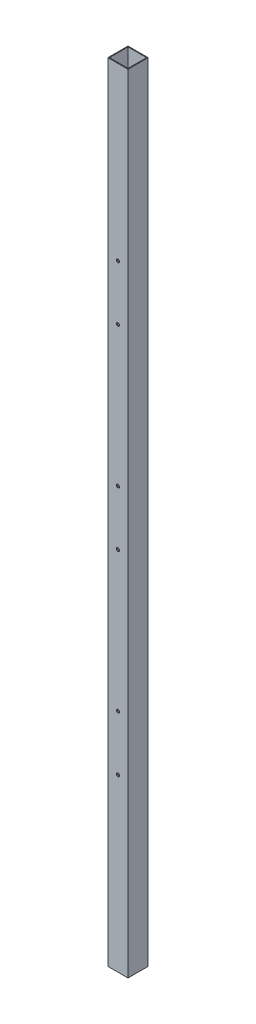
ISO-10303-21;
HEADER;
FILE_DESCRIPTION(('STEP AP214'),'2;1');
FILE_NAME('part.step','',(''),(''),'','','');
FILE_SCHEMA(('AUTOMOTIVE_DESIGN { 1 0 10303 214 1 1 1 1 }'));
ENDSEC;
DATA;
#1=APPLICATION_CONTEXT('core data for automotive mechanical design processes');
#2=APPLICATION_PROTOCOL_DEFINITION('international standard','automotive_design',2000,#1);
#3=PRODUCT_CONTEXT('',#1,'mechanical');
#4=PRODUCT('Part','Part','',(#3));
#5=PRODUCT_RELATED_PRODUCT_CATEGORY('part','',(#4));
#6=PRODUCT_DEFINITION_FORMATION('','',#4);
#7=PRODUCT_DEFINITION_CONTEXT('part definition',#1,'design');
#8=PRODUCT_DEFINITION('design','',#6,#7);
#9=PRODUCT_DEFINITION_SHAPE('','',#8);
#10=(LENGTH_UNIT() NAMED_UNIT(*) SI_UNIT(.MILLI.,.METRE.));
#11=(NAMED_UNIT(*) PLANE_ANGLE_UNIT() SI_UNIT($,.RADIAN.));
#12=(NAMED_UNIT(*) SI_UNIT($,.STERADIAN.) SOLID_ANGLE_UNIT());
#13=UNCERTAINTY_MEASURE_WITH_UNIT(LENGTH_MEASURE(1.E-05),#10,'distance_accuracy_value','');
#14=(GEOMETRIC_REPRESENTATION_CONTEXT(3) GLOBAL_UNCERTAINTY_ASSIGNED_CONTEXT((#13)) GLOBAL_UNIT_ASSIGNED_CONTEXT((#10,
#11,#12)) REPRESENTATION_CONTEXT('',''));
#15=CARTESIAN_POINT('',(0.,0.,0.));
#16=DIRECTION('',(0.,0.,1.));
#17=DIRECTION('',(1.,0.,0.));
#18=AXIS2_PLACEMENT_3D('',#15,#16,#17);
#19=CARTESIAN_POINT('',(0.,1000.,0.));
#20=DIRECTION('',(0.,1.,0.));
#21=DIRECTION('',(0.,0.,1.));
#22=AXIS2_PLACEMENT_3D('',#19,#20,#21);
#23=PLANE('',#22);
#24=DIRECTION('',(0.,0.,-1.));
#25=VECTOR('',#24,1.);
#26=CARTESIAN_POINT('',(12.8,1000.,-12.8));
#27=LINE('',#26,#25);
#28=CARTESIAN_POINT('',(12.8,1000.,12.8));
#29=VERTEX_POINT('',#28);
#30=CARTESIAN_POINT('',(12.8,1000.,-12.8));
#31=VERTEX_POINT('',#30);
#32=EDGE_CURVE('E151',#29,#31,#27,.T.);
#33=ORIENTED_EDGE('',*,*,#32,.T.);
#34=DIRECTION('',(-1.,0.,0.));
#35=VECTOR('',#34,1.);
#36=CARTESIAN_POINT('',(-12.8,1000.,-12.8));
#37=LINE('',#36,#35);
#38=CARTESIAN_POINT('',(-12.8,1000.,-12.8));
#39=VERTEX_POINT('',#38);
#40=EDGE_CURVE('E154',#31,#39,#37,.T.);
#41=ORIENTED_EDGE('',*,*,#40,.T.);
#42=DIRECTION('',(0.,0.,1.));
#43=VECTOR('',#42,1.);
#44=CARTESIAN_POINT('',(-12.8,1000.,-12.8));
#45=LINE('',#44,#43);
#46=CARTESIAN_POINT('',(-12.8,1000.,12.8));
#47=VERTEX_POINT('',#46);
#48=EDGE_CURVE('E157',#39,#47,#45,.T.);
#49=ORIENTED_EDGE('',*,*,#48,.T.);
#50=DIRECTION('',(1.,0.,0.));
#51=VECTOR('',#50,1.);
#52=CARTESIAN_POINT('',(-12.8,1000.,12.8));
#53=LINE('',#52,#51);
#54=EDGE_CURVE('E159',#47,#29,#53,.T.);
#55=ORIENTED_EDGE('',*,*,#54,.T.);
#56=EDGE_LOOP('',(#33,#41,#49,#55));
#57=FACE_BOUND('',#56,.T.);
#58=DIRECTION('',(1.,0.,0.));
#59=VECTOR('',#58,1.);
#60=CARTESIAN_POINT('',(-11.8,1000.,11.8));
#61=LINE('',#60,#59);
#62=CARTESIAN_POINT('',(-11.8,1000.,11.8));
#63=VERTEX_POINT('',#62);
#64=CARTESIAN_POINT('',(11.8,1000.,11.8));
#65=VERTEX_POINT('',#64);
#66=EDGE_CURVE('E121',#63,#65,#61,.T.);
#67=ORIENTED_EDGE('',*,*,#66,.F.);
#68=DIRECTION('',(0.,0.,1.));
#69=VECTOR('',#68,1.);
#70=CARTESIAN_POINT('',(-11.8,1000.,-11.8));
#71=LINE('',#70,#69);
#72=CARTESIAN_POINT('',(-11.8,1000.,-11.8));
#73=VERTEX_POINT('',#72);
#74=EDGE_CURVE('E113',#73,#63,#71,.T.);
#75=ORIENTED_EDGE('',*,*,#74,.F.);
#76=DIRECTION('',(-1.,0.,0.));
#77=VECTOR('',#76,1.);
#78=CARTESIAN_POINT('',(-11.8,1000.,-11.8));
#79=LINE('',#78,#77);
#80=CARTESIAN_POINT('',(11.8,1000.,-11.8));
#81=VERTEX_POINT('',#80);
#82=EDGE_CURVE('E135',#81,#73,#79,.T.);
#83=ORIENTED_EDGE('',*,*,#82,.F.);
#84=DIRECTION('',(0.,0.,-1.));
#85=VECTOR('',#84,1.);
#86=CARTESIAN_POINT('',(11.8,1000.,-11.8));
#87=LINE('',#86,#85);
#88=EDGE_CURVE('E133',#65,#81,#87,.T.);
#89=ORIENTED_EDGE('',*,*,#88,.F.);
#90=EDGE_LOOP('',(#67,#75,#83,#89));
#91=FACE_BOUND('',#90,.T.);
#92=ADVANCED_FACE('F46',(#57,#91),#23,.T.);
#93=CARTESIAN_POINT('',(0.,0.,0.));
#94=DIRECTION('',(0.,1.,0.));
#95=DIRECTION('',(0.,0.,1.));
#96=AXIS2_PLACEMENT_3D('',#93,#94,#95);
#97=PLANE('',#96);
#98=DIRECTION('',(0.,0.,-1.));
#99=VECTOR('',#98,1.);
#100=CARTESIAN_POINT('',(12.8,0.,-12.8));
#101=LINE('',#100,#99);
#102=CARTESIAN_POINT('',(12.8,0.,12.8));
#103=VERTEX_POINT('',#102);
#104=CARTESIAN_POINT('',(12.8,0.,-12.8));
#105=VERTEX_POINT('',#104);
#106=EDGE_CURVE('E129',#103,#105,#101,.T.);
#107=ORIENTED_EDGE('',*,*,#106,.F.);
#108=DIRECTION('',(1.,0.,0.));
#109=VECTOR('',#108,1.);
#110=CARTESIAN_POINT('',(-12.8,0.,12.8));
#111=LINE('',#110,#109);
#112=CARTESIAN_POINT('',(-12.8,0.,12.8));
#113=VERTEX_POINT('',#112);
#114=EDGE_CURVE('E155',#113,#103,#111,.T.);
#115=ORIENTED_EDGE('',*,*,#114,.F.);
#116=DIRECTION('',(0.,0.,1.));
#117=VECTOR('',#116,1.);
#118=CARTESIAN_POINT('',(-12.8,0.,-12.8));
#119=LINE('',#118,#117);
#120=CARTESIAN_POINT('',(-12.8,0.,-12.8));
#121=VERTEX_POINT('',#120);
#122=EDGE_CURVE('E166',#121,#113,#119,.T.);
#123=ORIENTED_EDGE('',*,*,#122,.F.);
#124=DIRECTION('',(-1.,0.,0.));
#125=VECTOR('',#124,1.);
#126=CARTESIAN_POINT('',(-12.8,0.,-12.8));
#127=LINE('',#126,#125);
#128=EDGE_CURVE('E164',#105,#121,#127,.T.);
#129=ORIENTED_EDGE('',*,*,#128,.F.);
#130=EDGE_LOOP('',(#107,#115,#123,#129));
#131=FACE_BOUND('',#130,.T.);
#132=DIRECTION('',(0.,0.,1.));
#133=VECTOR('',#132,1.);
#134=CARTESIAN_POINT('',(-11.8,0.,-11.8));
#135=LINE('',#134,#133);
#136=CARTESIAN_POINT('',(-11.8,0.,-11.8));
#137=VERTEX_POINT('',#136);
#138=CARTESIAN_POINT('',(-11.8,0.,11.8));
#139=VERTEX_POINT('',#138);
#140=EDGE_CURVE('E71',#137,#139,#135,.T.);
#141=ORIENTED_EDGE('',*,*,#140,.T.);
#142=DIRECTION('',(1.,0.,0.));
#143=VECTOR('',#142,1.);
#144=CARTESIAN_POINT('',(-11.8,0.,11.8));
#145=LINE('',#144,#143);
#146=CARTESIAN_POINT('',(11.8,0.,11.8));
#147=VERTEX_POINT('',#146);
#148=EDGE_CURVE('E128',#139,#147,#145,.T.);
#149=ORIENTED_EDGE('',*,*,#148,.T.);
#150=DIRECTION('',(0.,0.,-1.));
#151=VECTOR('',#150,1.);
#152=CARTESIAN_POINT('',(11.8,0.,-11.8));
#153=LINE('',#152,#151);
#154=CARTESIAN_POINT('',(11.8,0.,-11.8));
#155=VERTEX_POINT('',#154);
#156=EDGE_CURVE('E143',#147,#155,#153,.T.);
#157=ORIENTED_EDGE('',*,*,#156,.T.);
#158=DIRECTION('',(-1.,0.,0.));
#159=VECTOR('',#158,1.);
#160=CARTESIAN_POINT('',(-11.8,0.,-11.8));
#161=LINE('',#160,#159);
#162=EDGE_CURVE('E122',#155,#137,#161,.T.);
#163=ORIENTED_EDGE('',*,*,#162,.T.);
#164=EDGE_LOOP('',(#141,#149,#157,#163));
#165=FACE_BOUND('',#164,.T.);
#166=ADVANCED_FACE('F241',(#131,#165),#97,.F.);
#167=CARTESIAN_POINT('',(12.8,1000.,-12.8));
#168=DIRECTION('',(-1.,0.,0.));
#169=DIRECTION('',(0.,0.,1.));
#170=AXIS2_PLACEMENT_3D('',#167,#168,#169);
#171=PLANE('',#170);
#172=ORIENTED_EDGE('',*,*,#106,.T.);
#173=DIRECTION('',(0.,-1.,0.));
#174=VECTOR('',#173,1.);
#175=CARTESIAN_POINT('',(12.8,1000.,-12.8));
#176=LINE('',#175,#174);
#177=EDGE_CURVE('E11',#31,#105,#176,.T.);
#178=ORIENTED_EDGE('',*,*,#177,.F.);
#179=ORIENTED_EDGE('',*,*,#32,.F.);
#180=DIRECTION('',(0.,-1.,0.));
#181=VECTOR('',#180,1.);
#182=CARTESIAN_POINT('',(12.8,1000.,12.8));
#183=LINE('',#182,#181);
#184=EDGE_CURVE('E161',#29,#103,#183,.T.);
#185=ORIENTED_EDGE('',*,*,#184,.T.);
#186=EDGE_LOOP('',(#172,#178,#179,#185));
#187=FACE_BOUND('',#186,.T.);
#188=ADVANCED_FACE('F48',(#187),#171,.F.);
#189=CARTESIAN_POINT('',(-12.8,1000.,-12.8));
#190=DIRECTION('',(0.,0.,1.));
#191=DIRECTION('',(1.,0.,0.));
#192=AXIS2_PLACEMENT_3D('',#189,#190,#191);
#193=PLANE('',#192);
#194=CARTESIAN_POINT('',(0.,217.2,-12.8));
#195=DIRECTION('',(0.,0.,-1.));
#196=DIRECTION('',(1.,0.,0.));
#197=AXIS2_PLACEMENT_3D('',#194,#195,#196);
#198=CIRCLE('',#197,2.);
#199=CARTESIAN_POINT('',(2.00000000000001,217.2,-12.8));
#200=VERTEX_POINT('',#199);
#201=EDGE_CURVE('E268',#200,#200,#198,.T.);
#202=ORIENTED_EDGE('',*,*,#201,.F.);
#203=EDGE_LOOP('',(#202));
#204=FACE_BOUND('',#203,.T.);
#205=CARTESIAN_POINT('',(0.,465.,-12.8));
#206=DIRECTION('',(0.,0.,-1.));
#207=DIRECTION('',(-1.,0.,0.));
#208=AXIS2_PLACEMENT_3D('',#205,#206,#207);
#209=CIRCLE('',#208,2.);
#210=CARTESIAN_POINT('',(-2.,465.,-12.8));
#211=VERTEX_POINT('',#210);
#212=EDGE_CURVE('E272',#211,#211,#209,.T.);
#213=ORIENTED_EDGE('',*,*,#212,.F.);
#214=EDGE_LOOP('',(#213));
#215=FACE_BOUND('',#214,.T.);
#216=CARTESIAN_POINT('',(0.,782.8,-12.8));
#217=DIRECTION('',(0.,0.,-1.));
#218=DIRECTION('',(-1.,0.,0.));
#219=AXIS2_PLACEMENT_3D('',#216,#217,#218);
#220=CIRCLE('',#219,2.);
#221=CARTESIAN_POINT('',(-1.99999999999999,782.8,-12.8));
#222=VERTEX_POINT('',#221);
#223=EDGE_CURVE('E276',#222,#222,#220,.T.);
#224=ORIENTED_EDGE('',*,*,#223,.F.);
#225=EDGE_LOOP('',(#224));
#226=FACE_BOUND('',#225,.T.);
#227=CARTESIAN_POINT('',(0.,712.8,-12.8));
#228=DIRECTION('',(0.,0.,-1.));
#229=DIRECTION('',(-1.,0.,0.));
#230=AXIS2_PLACEMENT_3D('',#227,#228,#229);
#231=CIRCLE('',#230,2.);
#232=CARTESIAN_POINT('',(-2.,712.8,-12.8));
#233=VERTEX_POINT('',#232);
#234=EDGE_CURVE('E280',#233,#233,#231,.T.);
#235=ORIENTED_EDGE('',*,*,#234,.F.);
#236=EDGE_LOOP('',(#235));
#237=FACE_BOUND('',#236,.T.);
#238=CARTESIAN_POINT('',(0.,287.2,-12.8));
#239=DIRECTION('',(0.,0.,-1.));
#240=DIRECTION('',(1.,0.,0.));
#241=AXIS2_PLACEMENT_3D('',#238,#239,#240);
#242=CIRCLE('',#241,2.);
#243=CARTESIAN_POINT('',(2.,287.2,-12.8));
#244=VERTEX_POINT('',#243);
#245=EDGE_CURVE('E284',#244,#244,#242,.T.);
#246=ORIENTED_EDGE('',*,*,#245,.F.);
#247=EDGE_LOOP('',(#246));
#248=FACE_BOUND('',#247,.T.);
#249=CARTESIAN_POINT('',(0.,535.,-12.8));
#250=DIRECTION('',(0.,0.,-1.));
#251=DIRECTION('',(-1.,0.,0.));
#252=AXIS2_PLACEMENT_3D('',#249,#250,#251);
#253=CIRCLE('',#252,2.);
#254=CARTESIAN_POINT('',(-2.,535.,-12.8));
#255=VERTEX_POINT('',#254);
#256=EDGE_CURVE('E180',#255,#255,#253,.T.);
#257=ORIENTED_EDGE('',*,*,#256,.F.);
#258=EDGE_LOOP('',(#257));
#259=FACE_BOUND('',#258,.T.);
#260=ORIENTED_EDGE('',*,*,#128,.T.);
#261=DIRECTION('',(0.,-1.,0.));
#262=VECTOR('',#261,1.);
#263=CARTESIAN_POINT('',(-12.8,1000.,-12.8));
#264=LINE('',#263,#262);
#265=EDGE_CURVE('E55',#39,#121,#264,.T.);
#266=ORIENTED_EDGE('',*,*,#265,.F.);
#267=ORIENTED_EDGE('',*,*,#40,.F.);
#268=ORIENTED_EDGE('',*,*,#177,.T.);
#269=EDGE_LOOP('',(#260,#266,#267,#268));
#270=FACE_BOUND('',#269,.T.);
#271=ADVANCED_FACE('F256',(#204,#215,#226,#237,#248,#259,#270),#193,.F.);
#272=CARTESIAN_POINT('',(-12.8,1000.,-12.8));
#273=DIRECTION('',(1.,0.,0.));
#274=DIRECTION('',(0.,0.,-1.));
#275=AXIS2_PLACEMENT_3D('',#272,#273,#274);
#276=PLANE('',#275);
#277=ORIENTED_EDGE('',*,*,#122,.T.);
#278=DIRECTION('',(0.,-1.,0.));
#279=VECTOR('',#278,1.);
#280=CARTESIAN_POINT('',(-12.8,1000.,12.8));
#281=LINE('',#280,#279);
#282=EDGE_CURVE('E171',#47,#113,#281,.T.);
#283=ORIENTED_EDGE('',*,*,#282,.F.);
#284=ORIENTED_EDGE('',*,*,#48,.F.);
#285=ORIENTED_EDGE('',*,*,#265,.T.);
#286=EDGE_LOOP('',(#277,#283,#284,#285));
#287=FACE_BOUND('',#286,.T.);
#288=ADVANCED_FACE('F254',(#287),#276,.F.);
#289=CARTESIAN_POINT('',(-12.8,1000.,12.8));
#290=DIRECTION('',(0.,0.,-1.));
#291=DIRECTION('',(-1.,0.,0.));
#292=AXIS2_PLACEMENT_3D('',#289,#290,#291);
#293=PLANE('',#292);
#294=CARTESIAN_POINT('',(0.,217.2,12.8));
#295=DIRECTION('',(0.,0.,-1.));
#296=DIRECTION('',(-1.,0.,0.));
#297=AXIS2_PLACEMENT_3D('',#294,#295,#296);
#298=CIRCLE('',#297,2.);
#299=CARTESIAN_POINT('',(-1.99999999999999,217.2,12.8));
#300=VERTEX_POINT('',#299);
#301=EDGE_CURVE('E141',#300,#300,#298,.T.);
#302=ORIENTED_EDGE('',*,*,#301,.T.);
#303=EDGE_LOOP('',(#302));
#304=FACE_BOUND('',#303,.T.);
#305=CARTESIAN_POINT('',(0.,465.,12.8));
#306=DIRECTION('',(0.,0.,-1.));
#307=DIRECTION('',(-1.,0.,0.));
#308=AXIS2_PLACEMENT_3D('',#305,#306,#307);
#309=CIRCLE('',#308,2.);
#310=CARTESIAN_POINT('',(-2.,465.,12.8));
#311=VERTEX_POINT('',#310);
#312=EDGE_CURVE('E202',#311,#311,#309,.T.);
#313=ORIENTED_EDGE('',*,*,#312,.T.);
#314=EDGE_LOOP('',(#313));
#315=FACE_BOUND('',#314,.T.);
#316=CARTESIAN_POINT('',(0.,782.8,12.8));
#317=DIRECTION('',(0.,0.,-1.));
#318=DIRECTION('',(-1.,0.,0.));
#319=AXIS2_PLACEMENT_3D('',#316,#317,#318);
#320=CIRCLE('',#319,2.);
#321=CARTESIAN_POINT('',(-1.99999999999999,782.8,12.8));
#322=VERTEX_POINT('',#321);
#323=EDGE_CURVE('E198',#322,#322,#320,.T.);
#324=ORIENTED_EDGE('',*,*,#323,.T.);
#325=EDGE_LOOP('',(#324));
#326=FACE_BOUND('',#325,.T.);
#327=CARTESIAN_POINT('',(0.,712.8,12.8));
#328=DIRECTION('',(0.,0.,-1.));
#329=DIRECTION('',(-1.,0.,0.));
#330=AXIS2_PLACEMENT_3D('',#327,#328,#329);
#331=CIRCLE('',#330,2.);
#332=CARTESIAN_POINT('',(-2.,712.8,12.8));
#333=VERTEX_POINT('',#332);
#334=EDGE_CURVE('E194',#333,#333,#331,.T.);
#335=ORIENTED_EDGE('',*,*,#334,.T.);
#336=EDGE_LOOP('',(#335));
#337=FACE_BOUND('',#336,.T.);
#338=CARTESIAN_POINT('',(0.,287.2,12.8));
#339=DIRECTION('',(0.,0.,-1.));
#340=DIRECTION('',(-1.,0.,0.));
#341=AXIS2_PLACEMENT_3D('',#338,#339,#340);
#342=CIRCLE('',#341,2.);
#343=CARTESIAN_POINT('',(-2.,287.2,12.8));
#344=VERTEX_POINT('',#343);
#345=EDGE_CURVE('E190',#344,#344,#342,.T.);
#346=ORIENTED_EDGE('',*,*,#345,.T.);
#347=EDGE_LOOP('',(#346));
#348=FACE_BOUND('',#347,.T.);
#349=CARTESIAN_POINT('',(0.,535.,12.8));
#350=DIRECTION('',(0.,0.,-1.));
#351=DIRECTION('',(-1.,0.,0.));
#352=AXIS2_PLACEMENT_3D('',#349,#350,#351);
#353=CIRCLE('',#352,2.);
#354=CARTESIAN_POINT('',(-2.,535.,12.8));
#355=VERTEX_POINT('',#354);
#356=EDGE_CURVE('E185',#355,#355,#353,.T.);
#357=ORIENTED_EDGE('',*,*,#356,.T.);
#358=EDGE_LOOP('',(#357));
#359=FACE_BOUND('',#358,.T.);
#360=ORIENTED_EDGE('',*,*,#114,.T.);
#361=ORIENTED_EDGE('',*,*,#184,.F.);
#362=ORIENTED_EDGE('',*,*,#54,.F.);
#363=ORIENTED_EDGE('',*,*,#282,.T.);
#364=EDGE_LOOP('',(#360,#361,#362,#363));
#365=FACE_BOUND('',#364,.T.);
#366=ADVANCED_FACE('F219',(#304,#315,#326,#337,#348,#359,#365),#293,.F.);
#367=CARTESIAN_POINT('',(-11.8,1000.,-11.8));
#368=DIRECTION('',(1.,0.,0.));
#369=DIRECTION('',(0.,0.,-1.));
#370=AXIS2_PLACEMENT_3D('',#367,#368,#369);
#371=PLANE('',#370);
#372=ORIENTED_EDGE('',*,*,#140,.F.);
#373=DIRECTION('',(0.,-1.,0.));
#374=VECTOR('',#373,1.);
#375=CARTESIAN_POINT('',(-11.8,1000.,-11.8));
#376=LINE('',#375,#374);
#377=EDGE_CURVE('E117',#73,#137,#376,.T.);
#378=ORIENTED_EDGE('',*,*,#377,.F.);
#379=ORIENTED_EDGE('',*,*,#74,.T.);
#380=DIRECTION('',(0.,-1.,0.));
#381=VECTOR('',#380,1.);
#382=CARTESIAN_POINT('',(-11.8,1000.,11.8));
#383=LINE('',#382,#381);
#384=EDGE_CURVE('E116',#63,#139,#383,.T.);
#385=ORIENTED_EDGE('',*,*,#384,.T.);
#386=EDGE_LOOP('',(#372,#378,#379,#385));
#387=FACE_BOUND('',#386,.T.);
#388=ADVANCED_FACE('F115',(#387),#371,.T.);
#389=CARTESIAN_POINT('',(-11.8,1000.,11.8));
#390=DIRECTION('',(0.,0.,-1.));
#391=DIRECTION('',(-1.,0.,0.));
#392=AXIS2_PLACEMENT_3D('',#389,#390,#391);
#393=PLANE('',#392);
#394=CARTESIAN_POINT('',(0.,217.2,11.8));
#395=DIRECTION('',(0.,0.,-1.));
#396=DIRECTION('',(-1.,0.,0.));
#397=AXIS2_PLACEMENT_3D('',#394,#395,#396);
#398=CIRCLE('',#397,2.);
#399=CARTESIAN_POINT('',(-1.99999999999999,217.2,11.8));
#400=VERTEX_POINT('',#399);
#401=EDGE_CURVE('E214',#400,#400,#398,.T.);
#402=ORIENTED_EDGE('',*,*,#401,.F.);
#403=EDGE_LOOP('',(#402));
#404=FACE_BOUND('',#403,.T.);
#405=CARTESIAN_POINT('',(0.,465.,11.8));
#406=DIRECTION('',(0.,0.,-1.));
#407=DIRECTION('',(-1.,0.,0.));
#408=AXIS2_PLACEMENT_3D('',#405,#406,#407);
#409=CIRCLE('',#408,2.);
#410=CARTESIAN_POINT('',(-2.,465.,11.8));
#411=VERTEX_POINT('',#410);
#412=EDGE_CURVE('E197',#411,#411,#409,.T.);
#413=ORIENTED_EDGE('',*,*,#412,.F.);
#414=EDGE_LOOP('',(#413));
#415=FACE_BOUND('',#414,.T.);
#416=CARTESIAN_POINT('',(0.,782.8,11.8));
#417=DIRECTION('',(0.,0.,-1.));
#418=DIRECTION('',(-1.,0.,0.));
#419=AXIS2_PLACEMENT_3D('',#416,#417,#418);
#420=CIRCLE('',#419,2.);
#421=CARTESIAN_POINT('',(-1.99999999999999,782.8,11.8));
#422=VERTEX_POINT('',#421);
#423=EDGE_CURVE('E193',#422,#422,#420,.T.);
#424=ORIENTED_EDGE('',*,*,#423,.F.);
#425=EDGE_LOOP('',(#424));
#426=FACE_BOUND('',#425,.T.);
#427=CARTESIAN_POINT('',(0.,712.8,11.8));
#428=DIRECTION('',(0.,0.,-1.));
#429=DIRECTION('',(-1.,0.,0.));
#430=AXIS2_PLACEMENT_3D('',#427,#428,#429);
#431=CIRCLE('',#430,2.);
#432=CARTESIAN_POINT('',(-2.,712.8,11.8));
#433=VERTEX_POINT('',#432);
#434=EDGE_CURVE('E189',#433,#433,#431,.T.);
#435=ORIENTED_EDGE('',*,*,#434,.F.);
#436=EDGE_LOOP('',(#435));
#437=FACE_BOUND('',#436,.T.);
#438=CARTESIAN_POINT('',(0.,287.2,11.8));
#439=DIRECTION('',(0.,0.,-1.));
#440=DIRECTION('',(-1.,0.,0.));
#441=AXIS2_PLACEMENT_3D('',#438,#439,#440);
#442=CIRCLE('',#441,2.);
#443=CARTESIAN_POINT('',(-2.,287.2,11.8));
#444=VERTEX_POINT('',#443);
#445=EDGE_CURVE('E184',#444,#444,#442,.T.);
#446=ORIENTED_EDGE('',*,*,#445,.F.);
#447=EDGE_LOOP('',(#446));
#448=FACE_BOUND('',#447,.T.);
#449=CARTESIAN_POINT('',(0.,535.,11.8));
#450=DIRECTION('',(0.,0.,-1.));
#451=DIRECTION('',(-1.,0.,0.));
#452=AXIS2_PLACEMENT_3D('',#449,#450,#451);
#453=CIRCLE('',#452,2.);
#454=CARTESIAN_POINT('',(-2.,535.,11.8));
#455=VERTEX_POINT('',#454);
#456=EDGE_CURVE('E179',#455,#455,#453,.T.);
#457=ORIENTED_EDGE('',*,*,#456,.F.);
#458=EDGE_LOOP('',(#457));
#459=FACE_BOUND('',#458,.T.);
#460=ORIENTED_EDGE('',*,*,#148,.F.);
#461=ORIENTED_EDGE('',*,*,#384,.F.);
#462=ORIENTED_EDGE('',*,*,#66,.T.);
#463=DIRECTION('',(0.,-1.,0.));
#464=VECTOR('',#463,1.);
#465=CARTESIAN_POINT('',(11.8,1000.,11.8));
#466=LINE('',#465,#464);
#467=EDGE_CURVE('E130',#65,#147,#466,.T.);
#468=ORIENTED_EDGE('',*,*,#467,.T.);
#469=EDGE_LOOP('',(#460,#461,#462,#468));
#470=FACE_BOUND('',#469,.T.);
#471=ADVANCED_FACE('F125',(#404,#415,#426,#437,#448,#459,#470),#393,.T.);
#472=CARTESIAN_POINT('',(11.8,1000.,-11.8));
#473=DIRECTION('',(-1.,0.,0.));
#474=DIRECTION('',(0.,0.,1.));
#475=AXIS2_PLACEMENT_3D('',#472,#473,#474);
#476=PLANE('',#475);
#477=ORIENTED_EDGE('',*,*,#156,.F.);
#478=ORIENTED_EDGE('',*,*,#467,.F.);
#479=ORIENTED_EDGE('',*,*,#88,.T.);
#480=DIRECTION('',(0.,-1.,0.));
#481=VECTOR('',#480,1.);
#482=CARTESIAN_POINT('',(11.8,1000.,-11.8));
#483=LINE('',#482,#481);
#484=EDGE_CURVE('E63',#81,#155,#483,.T.);
#485=ORIENTED_EDGE('',*,*,#484,.T.);
#486=EDGE_LOOP('',(#477,#478,#479,#485));
#487=FACE_BOUND('',#486,.T.);
#488=ADVANCED_FACE('F304',(#487),#476,.T.);
#489=CARTESIAN_POINT('',(-11.8,1000.,-11.8));
#490=DIRECTION('',(0.,0.,1.));
#491=DIRECTION('',(1.,0.,0.));
#492=AXIS2_PLACEMENT_3D('',#489,#490,#491);
#493=PLANE('',#492);
#494=CARTESIAN_POINT('',(0.,217.2,-11.8));
#495=DIRECTION('',(0.,0.,1.));
#496=DIRECTION('',(1.,0.,0.));
#497=AXIS2_PLACEMENT_3D('',#494,#495,#496);
#498=CIRCLE('',#497,2.);
#499=CARTESIAN_POINT('',(2.00000000000001,217.2,-11.8));
#500=VERTEX_POINT('',#499);
#501=EDGE_CURVE('E50',#500,#500,#498,.T.);
#502=ORIENTED_EDGE('',*,*,#501,.F.);
#503=EDGE_LOOP('',(#502));
#504=FACE_BOUND('',#503,.T.);
#505=CARTESIAN_POINT('',(0.,465.,-11.8));
#506=DIRECTION('',(0.,0.,1.));
#507=DIRECTION('',(1.,0.,0.));
#508=AXIS2_PLACEMENT_3D('',#505,#506,#507);
#509=CIRCLE('',#508,2.);
#510=CARTESIAN_POINT('',(2.,465.,-11.8));
#511=VERTEX_POINT('',#510);
#512=EDGE_CURVE('E195',#511,#511,#509,.T.);
#513=ORIENTED_EDGE('',*,*,#512,.F.);
#514=EDGE_LOOP('',(#513));
#515=FACE_BOUND('',#514,.T.);
#516=CARTESIAN_POINT('',(0.,782.8,-11.8));
#517=DIRECTION('',(0.,0.,1.));
#518=DIRECTION('',(1.,0.,0.));
#519=AXIS2_PLACEMENT_3D('',#516,#517,#518);
#520=CIRCLE('',#519,2.);
#521=CARTESIAN_POINT('',(2.00000000000001,782.8,-11.8));
#522=VERTEX_POINT('',#521);
#523=EDGE_CURVE('E191',#522,#522,#520,.T.);
#524=ORIENTED_EDGE('',*,*,#523,.F.);
#525=EDGE_LOOP('',(#524));
#526=FACE_BOUND('',#525,.T.);
#527=CARTESIAN_POINT('',(0.,712.8,-11.8));
#528=DIRECTION('',(0.,0.,1.));
#529=DIRECTION('',(1.,0.,0.));
#530=AXIS2_PLACEMENT_3D('',#527,#528,#529);
#531=CIRCLE('',#530,2.);
#532=CARTESIAN_POINT('',(2.,712.8,-11.8));
#533=VERTEX_POINT('',#532);
#534=EDGE_CURVE('E186',#533,#533,#531,.T.);
#535=ORIENTED_EDGE('',*,*,#534,.F.);
#536=EDGE_LOOP('',(#535));
#537=FACE_BOUND('',#536,.T.);
#538=CARTESIAN_POINT('',(0.,287.2,-11.8));
#539=DIRECTION('',(0.,0.,1.));
#540=DIRECTION('',(1.,0.,0.));
#541=AXIS2_PLACEMENT_3D('',#538,#539,#540);
#542=CIRCLE('',#541,2.);
#543=CARTESIAN_POINT('',(2.,287.2,-11.8));
#544=VERTEX_POINT('',#543);
#545=EDGE_CURVE('E181',#544,#544,#542,.T.);
#546=ORIENTED_EDGE('',*,*,#545,.F.);
#547=EDGE_LOOP('',(#546));
#548=FACE_BOUND('',#547,.T.);
#549=CARTESIAN_POINT('',(0.,535.,-11.8));
#550=DIRECTION('',(0.,0.,1.));
#551=DIRECTION('',(1.,0.,0.));
#552=AXIS2_PLACEMENT_3D('',#549,#550,#551);
#553=CIRCLE('',#552,2.);
#554=CARTESIAN_POINT('',(2.,535.,-11.8));
#555=VERTEX_POINT('',#554);
#556=EDGE_CURVE('E176',#555,#555,#553,.T.);
#557=ORIENTED_EDGE('',*,*,#556,.F.);
#558=EDGE_LOOP('',(#557));
#559=FACE_BOUND('',#558,.T.);
#560=ORIENTED_EDGE('',*,*,#162,.F.);
#561=ORIENTED_EDGE('',*,*,#484,.F.);
#562=ORIENTED_EDGE('',*,*,#82,.T.);
#563=ORIENTED_EDGE('',*,*,#377,.T.);
#564=EDGE_LOOP('',(#560,#561,#562,#563));
#565=FACE_BOUND('',#564,.T.);
#566=ADVANCED_FACE('F301',(#504,#515,#526,#537,#548,#559,#565),#493,.T.);
#567=CARTESIAN_POINT('',(0.,535.,20.2));
#568=DIRECTION('',(0.,0.,-1.));
#569=DIRECTION('',(-1.,0.,0.));
#570=AXIS2_PLACEMENT_3D('',#567,#568,#569);
#571=CYLINDRICAL_SURFACE('',#570,2.);
#572=ORIENTED_EDGE('',*,*,#556,.T.);
#573=EDGE_LOOP('',(#572));
#574=FACE_BOUND('',#573,.T.);
#575=ORIENTED_EDGE('',*,*,#256,.T.);
#576=EDGE_LOOP('',(#575));
#577=FACE_BOUND('',#576,.T.);
#578=ADVANCED_FACE('F303',(#574,#577),#571,.F.);
#579=CARTESIAN_POINT('',(0.,287.2,20.2));
#580=DIRECTION('',(0.,0.,-1.));
#581=DIRECTION('',(-1.,0.,0.));
#582=AXIS2_PLACEMENT_3D('',#579,#580,#581);
#583=CYLINDRICAL_SURFACE('',#582,2.);
#584=ORIENTED_EDGE('',*,*,#545,.T.);
#585=EDGE_LOOP('',(#584));
#586=FACE_BOUND('',#585,.T.);
#587=ORIENTED_EDGE('',*,*,#245,.T.);
#588=EDGE_LOOP('',(#587));
#589=FACE_BOUND('',#588,.T.);
#590=ADVANCED_FACE('F311',(#586,#589),#583,.F.);
#591=CARTESIAN_POINT('',(0.,712.8,20.2));
#592=DIRECTION('',(0.,0.,-1.));
#593=DIRECTION('',(-1.,0.,0.));
#594=AXIS2_PLACEMENT_3D('',#591,#592,#593);
#595=CYLINDRICAL_SURFACE('',#594,2.);
#596=ORIENTED_EDGE('',*,*,#534,.T.);
#597=EDGE_LOOP('',(#596));
#598=FACE_BOUND('',#597,.T.);
#599=ORIENTED_EDGE('',*,*,#234,.T.);
#600=EDGE_LOOP('',(#599));
#601=FACE_BOUND('',#600,.T.);
#602=ADVANCED_FACE('F355',(#598,#601),#595,.F.);
#603=CARTESIAN_POINT('',(0.,782.8,20.2));
#604=DIRECTION('',(0.,0.,-1.));
#605=DIRECTION('',(-1.,0.,0.));
#606=AXIS2_PLACEMENT_3D('',#603,#604,#605);
#607=CYLINDRICAL_SURFACE('',#606,2.);
#608=ORIENTED_EDGE('',*,*,#523,.T.);
#609=EDGE_LOOP('',(#608));
#610=FACE_BOUND('',#609,.T.);
#611=ORIENTED_EDGE('',*,*,#223,.T.);
#612=EDGE_LOOP('',(#611));
#613=FACE_BOUND('',#612,.T.);
#614=ADVANCED_FACE('F361',(#610,#613),#607,.F.);
#615=CARTESIAN_POINT('',(0.,465.,20.2));
#616=DIRECTION('',(0.,0.,-1.));
#617=DIRECTION('',(-1.,0.,0.));
#618=AXIS2_PLACEMENT_3D('',#615,#616,#617);
#619=CYLINDRICAL_SURFACE('',#618,2.);
#620=ORIENTED_EDGE('',*,*,#512,.T.);
#621=EDGE_LOOP('',(#620));
#622=FACE_BOUND('',#621,.T.);
#623=ORIENTED_EDGE('',*,*,#212,.T.);
#624=EDGE_LOOP('',(#623));
#625=FACE_BOUND('',#624,.T.);
#626=ADVANCED_FACE('F234',(#622,#625),#619,.F.);
#627=CARTESIAN_POINT('',(0.,217.2,20.2));
#628=DIRECTION('',(0.,0.,-1.));
#629=DIRECTION('',(-1.,0.,0.));
#630=AXIS2_PLACEMENT_3D('',#627,#628,#629);
#631=CYLINDRICAL_SURFACE('',#630,2.);
#632=ORIENTED_EDGE('',*,*,#501,.T.);
#633=EDGE_LOOP('',(#632));
#634=FACE_BOUND('',#633,.T.);
#635=ORIENTED_EDGE('',*,*,#201,.T.);
#636=EDGE_LOOP('',(#635));
#637=FACE_BOUND('',#636,.T.);
#638=ADVANCED_FACE('F227',(#634,#637),#631,.F.);
#639=ORIENTED_EDGE('',*,*,#456,.T.);
#640=EDGE_LOOP('',(#639));
#641=FACE_BOUND('',#640,.T.);
#642=ORIENTED_EDGE('',*,*,#356,.F.);
#643=EDGE_LOOP('',(#642));
#644=FACE_BOUND('',#643,.T.);
#645=ADVANCED_FACE('F238',(#641,#644),#571,.F.);
#646=ORIENTED_EDGE('',*,*,#445,.T.);
#647=EDGE_LOOP('',(#646));
#648=FACE_BOUND('',#647,.T.);
#649=ORIENTED_EDGE('',*,*,#345,.F.);
#650=EDGE_LOOP('',(#649));
#651=FACE_BOUND('',#650,.T.);
#652=ADVANCED_FACE('F352',(#648,#651),#583,.F.);
#653=ORIENTED_EDGE('',*,*,#434,.T.);
#654=EDGE_LOOP('',(#653));
#655=FACE_BOUND('',#654,.T.);
#656=ORIENTED_EDGE('',*,*,#334,.F.);
#657=EDGE_LOOP('',(#656));
#658=FACE_BOUND('',#657,.T.);
#659=ADVANCED_FACE('F350',(#655,#658),#595,.F.);
#660=ORIENTED_EDGE('',*,*,#423,.T.);
#661=EDGE_LOOP('',(#660));
#662=FACE_BOUND('',#661,.T.);
#663=ORIENTED_EDGE('',*,*,#323,.F.);
#664=EDGE_LOOP('',(#663));
#665=FACE_BOUND('',#664,.T.);
#666=ADVANCED_FACE('F231',(#662,#665),#607,.F.);
#667=ORIENTED_EDGE('',*,*,#412,.T.);
#668=EDGE_LOOP('',(#667));
#669=FACE_BOUND('',#668,.T.);
#670=ORIENTED_EDGE('',*,*,#312,.F.);
#671=EDGE_LOOP('',(#670));
#672=FACE_BOUND('',#671,.T.);
#673=ADVANCED_FACE('F224',(#669,#672),#619,.F.);
#674=ORIENTED_EDGE('',*,*,#401,.T.);
#675=EDGE_LOOP('',(#674));
#676=FACE_BOUND('',#675,.T.);
#677=ORIENTED_EDGE('',*,*,#301,.F.);
#678=EDGE_LOOP('',(#677));
#679=FACE_BOUND('',#678,.T.);
#680=ADVANCED_FACE('F222',(#676,#679),#631,.F.);
#681=CLOSED_SHELL('',(#92,#166,#188,#271,#288,#366,#388,#471,#488,#566,#578,#590,#602,#614,#626,
#638,#645,#652,#659,#666,#673,#680));
#682=MANIFOLD_SOLID_BREP('B2',#681);
#683=ADVANCED_BREP_SHAPE_REPRESENTATION('',(#18,#682),#14);
#684=SHAPE_DEFINITION_REPRESENTATION(#9,#683);
ENDSEC;
END-ISO-10303-21;
